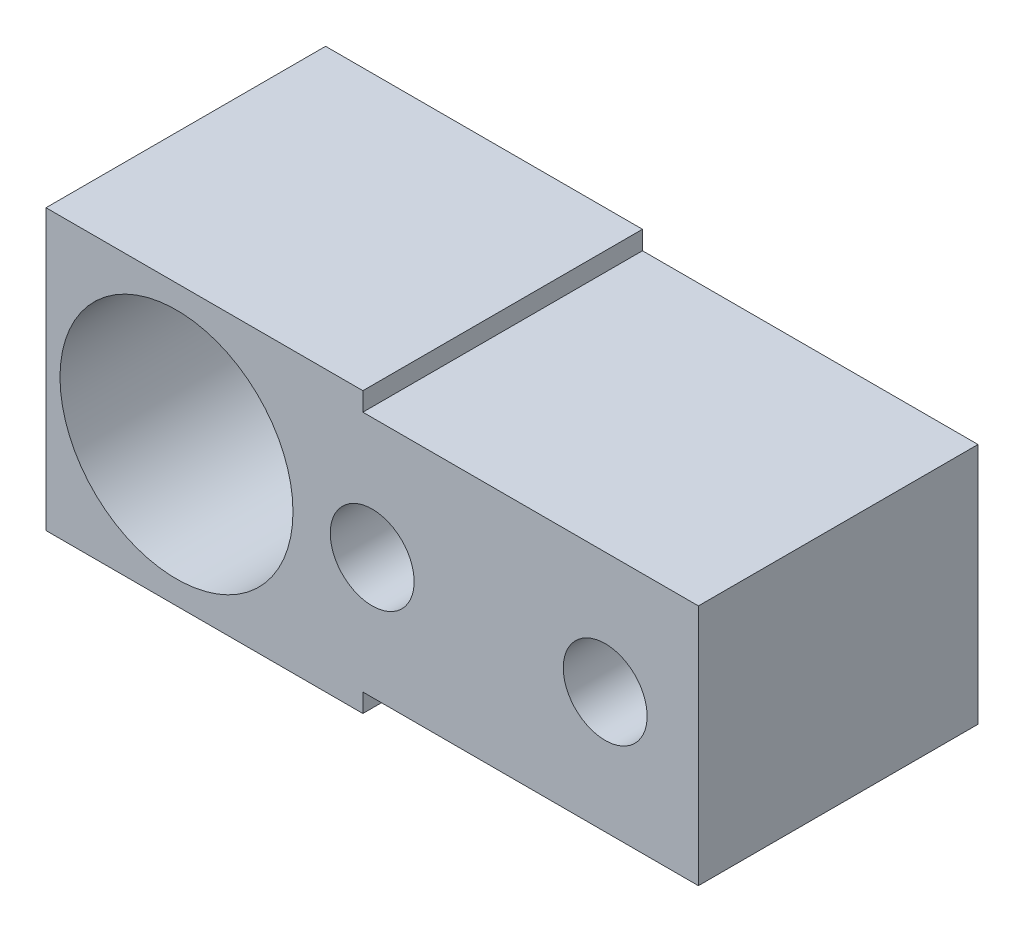
ISO-10303-21;
HEADER;
FILE_DESCRIPTION(('STEP AP214'),'2;1');
FILE_NAME('part.step','',(''),(''),'','','');
FILE_SCHEMA(('AUTOMOTIVE_DESIGN { 1 0 10303 214 1 1 1 1 }'));
ENDSEC;
DATA;
#1=APPLICATION_CONTEXT('core data for automotive mechanical design processes');
#2=APPLICATION_PROTOCOL_DEFINITION('international standard','automotive_design',2000,#1);
#3=PRODUCT_CONTEXT('',#1,'mechanical');
#4=PRODUCT('Part','Part','',(#3));
#5=PRODUCT_RELATED_PRODUCT_CATEGORY('part','',(#4));
#6=PRODUCT_DEFINITION_FORMATION('','',#4);
#7=PRODUCT_DEFINITION_CONTEXT('part definition',#1,'design');
#8=PRODUCT_DEFINITION('design','',#6,#7);
#9=PRODUCT_DEFINITION_SHAPE('','',#8);
#10=(LENGTH_UNIT() NAMED_UNIT(*) SI_UNIT(.MILLI.,.METRE.));
#11=(NAMED_UNIT(*) PLANE_ANGLE_UNIT() SI_UNIT($,.RADIAN.));
#12=(NAMED_UNIT(*) SI_UNIT($,.STERADIAN.) SOLID_ANGLE_UNIT());
#13=UNCERTAINTY_MEASURE_WITH_UNIT(LENGTH_MEASURE(1.E-05),#10,'distance_accuracy_value','');
#14=(GEOMETRIC_REPRESENTATION_CONTEXT(3) GLOBAL_UNCERTAINTY_ASSIGNED_CONTEXT((#13)) GLOBAL_UNIT_ASSIGNED_CONTEXT((#10,
#11,#12)) REPRESENTATION_CONTEXT('',''));
#15=CARTESIAN_POINT('',(0.,0.,0.));
#16=DIRECTION('',(0.,0.,1.));
#17=DIRECTION('',(1.,0.,0.));
#18=AXIS2_PLACEMENT_3D('',#15,#16,#17);
#19=CARTESIAN_POINT('',(0.,-15.,30.));
#20=DIRECTION('',(1.,0.,0.));
#21=DIRECTION('',(0.,1.,0.));
#22=AXIS2_PLACEMENT_3D('',#19,#20,#21);
#23=PLANE('',#22);
#24=DIRECTION('',(0.,-1.,0.));
#25=VECTOR('',#24,1.);
#26=CARTESIAN_POINT('',(0.,-15.,0.));
#27=LINE('',#26,#25);
#28=CARTESIAN_POINT('',(0.,15.,0.));
#29=VERTEX_POINT('',#28);
#30=CARTESIAN_POINT('',(0.,-15.,0.));
#31=VERTEX_POINT('',#30);
#32=EDGE_CURVE('E134',#29,#31,#27,.T.);
#33=ORIENTED_EDGE('',*,*,#32,.T.);
#34=DIRECTION('',(0.,0.,-1.));
#35=VECTOR('',#34,1.);
#36=CARTESIAN_POINT('',(0.,-15.,30.));
#37=LINE('',#36,#35);
#38=CARTESIAN_POINT('',(0.,-15.,30.));
#39=VERTEX_POINT('',#38);
#40=EDGE_CURVE('E162',#39,#31,#37,.T.);
#41=ORIENTED_EDGE('',*,*,#40,.F.);
#42=DIRECTION('',(0.,-1.,0.));
#43=VECTOR('',#42,1.);
#44=CARTESIAN_POINT('',(0.,-15.,30.));
#45=LINE('',#44,#43);
#46=CARTESIAN_POINT('',(0.,15.,30.));
#47=VERTEX_POINT('',#46);
#48=EDGE_CURVE('E149',#47,#39,#45,.T.);
#49=ORIENTED_EDGE('',*,*,#48,.F.);
#50=DIRECTION('',(0.,0.,-1.));
#51=VECTOR('',#50,1.);
#52=CARTESIAN_POINT('',(0.,15.,30.));
#53=LINE('',#52,#51);
#54=EDGE_CURVE('E130',#47,#29,#53,.T.);
#55=ORIENTED_EDGE('',*,*,#54,.T.);
#56=EDGE_LOOP('',(#33,#41,#49,#55));
#57=FACE_BOUND('',#56,.T.);
#58=ADVANCED_FACE('F36',(#57),#23,.F.);
#59=CARTESIAN_POINT('',(0.,-15.,30.));
#60=DIRECTION('',(0.,1.,0.));
#61=DIRECTION('',(0.,0.,1.));
#62=AXIS2_PLACEMENT_3D('',#59,#60,#61);
#63=PLANE('',#62);
#64=DIRECTION('',(1.,0.,0.));
#65=VECTOR('',#64,1.);
#66=CARTESIAN_POINT('',(0.,-15.,0.));
#67=LINE('',#66,#65);
#68=CARTESIAN_POINT('',(34.,-15.,0.));
#69=VERTEX_POINT('',#68);
#70=EDGE_CURVE('E137',#31,#69,#67,.T.);
#71=ORIENTED_EDGE('',*,*,#70,.T.);
#72=DIRECTION('',(0.,0.,-1.));
#73=VECTOR('',#72,1.);
#74=CARTESIAN_POINT('',(34.,-15.,30.));
#75=LINE('',#74,#73);
#76=CARTESIAN_POINT('',(34.,-15.,30.));
#77=VERTEX_POINT('',#76);
#78=EDGE_CURVE('E159',#77,#69,#75,.T.);
#79=ORIENTED_EDGE('',*,*,#78,.F.);
#80=DIRECTION('',(1.,0.,0.));
#81=VECTOR('',#80,1.);
#82=CARTESIAN_POINT('',(0.,-15.,30.));
#83=LINE('',#82,#81);
#84=EDGE_CURVE('E97',#39,#77,#83,.T.);
#85=ORIENTED_EDGE('',*,*,#84,.F.);
#86=ORIENTED_EDGE('',*,*,#40,.T.);
#87=EDGE_LOOP('',(#71,#79,#85,#86));
#88=FACE_BOUND('',#87,.T.);
#89=ADVANCED_FACE('F180',(#88),#63,.F.);
#90=CARTESIAN_POINT('',(34.,-13.,30.));
#91=DIRECTION('',(-1.,0.,0.));
#92=DIRECTION('',(0.,0.,1.));
#93=AXIS2_PLACEMENT_3D('',#90,#91,#92);
#94=PLANE('',#93);
#95=DIRECTION('',(0.,1.,0.));
#96=VECTOR('',#95,1.);
#97=CARTESIAN_POINT('',(34.,-13.,0.));
#98=LINE('',#97,#96);
#99=CARTESIAN_POINT('',(34.,-13.,0.));
#100=VERTEX_POINT('',#99);
#101=EDGE_CURVE('E140',#69,#100,#98,.T.);
#102=ORIENTED_EDGE('',*,*,#101,.T.);
#103=DIRECTION('',(0.,0.,-1.));
#104=VECTOR('',#103,1.);
#105=CARTESIAN_POINT('',(34.,-13.,30.));
#106=LINE('',#105,#104);
#107=CARTESIAN_POINT('',(34.,-13.,30.));
#108=VERTEX_POINT('',#107);
#109=EDGE_CURVE('E156',#108,#100,#106,.T.);
#110=ORIENTED_EDGE('',*,*,#109,.F.);
#111=DIRECTION('',(0.,1.,0.));
#112=VECTOR('',#111,1.);
#113=CARTESIAN_POINT('',(34.,-13.,30.));
#114=LINE('',#113,#112);
#115=EDGE_CURVE('E281',#77,#108,#114,.T.);
#116=ORIENTED_EDGE('',*,*,#115,.F.);
#117=ORIENTED_EDGE('',*,*,#78,.T.);
#118=EDGE_LOOP('',(#102,#110,#116,#117));
#119=FACE_BOUND('',#118,.T.);
#120=ADVANCED_FACE('F185',(#119),#94,.F.);
#121=CARTESIAN_POINT('',(70.,-13.,30.));
#122=DIRECTION('',(0.,1.,0.));
#123=DIRECTION('',(-1.,0.,0.));
#124=AXIS2_PLACEMENT_3D('',#121,#122,#123);
#125=PLANE('',#124);
#126=DIRECTION('',(1.,0.,0.));
#127=VECTOR('',#126,1.);
#128=CARTESIAN_POINT('',(70.,-13.,0.));
#129=LINE('',#128,#127);
#130=CARTESIAN_POINT('',(70.,-13.,0.));
#131=VERTEX_POINT('',#130);
#132=EDGE_CURVE('E142',#100,#131,#129,.T.);
#133=ORIENTED_EDGE('',*,*,#132,.T.);
#134=DIRECTION('',(0.,0.,-1.));
#135=VECTOR('',#134,1.);
#136=CARTESIAN_POINT('',(70.,-13.,30.));
#137=LINE('',#136,#135);
#138=CARTESIAN_POINT('',(70.,-13.,30.));
#139=VERTEX_POINT('',#138);
#140=EDGE_CURVE('E153',#139,#131,#137,.T.);
#141=ORIENTED_EDGE('',*,*,#140,.F.);
#142=DIRECTION('',(1.,0.,0.));
#143=VECTOR('',#142,1.);
#144=CARTESIAN_POINT('',(70.,-13.,30.));
#145=LINE('',#144,#143);
#146=EDGE_CURVE('E283',#108,#139,#145,.T.);
#147=ORIENTED_EDGE('',*,*,#146,.F.);
#148=ORIENTED_EDGE('',*,*,#109,.T.);
#149=EDGE_LOOP('',(#133,#141,#147,#148));
#150=FACE_BOUND('',#149,.T.);
#151=ADVANCED_FACE('F190',(#150),#125,.F.);
#152=CARTESIAN_POINT('',(70.,-13.,30.));
#153=DIRECTION('',(-1.,0.,0.));
#154=DIRECTION('',(0.,0.,1.));
#155=AXIS2_PLACEMENT_3D('',#152,#153,#154);
#156=PLANE('',#155);
#157=DIRECTION('',(0.,1.,0.));
#158=VECTOR('',#157,1.);
#159=CARTESIAN_POINT('',(70.,-13.,0.));
#160=LINE('',#159,#158);
#161=CARTESIAN_POINT('',(70.,13.,0.));
#162=VERTEX_POINT('',#161);
#163=EDGE_CURVE('E144',#131,#162,#160,.T.);
#164=ORIENTED_EDGE('',*,*,#163,.T.);
#165=DIRECTION('',(0.,0.,-1.));
#166=VECTOR('',#165,1.);
#167=CARTESIAN_POINT('',(70.,13.,30.));
#168=LINE('',#167,#166);
#169=CARTESIAN_POINT('',(70.,13.,30.));
#170=VERTEX_POINT('',#169);
#171=EDGE_CURVE('E125',#170,#162,#168,.T.);
#172=ORIENTED_EDGE('',*,*,#171,.F.);
#173=DIRECTION('',(0.,1.,0.));
#174=VECTOR('',#173,1.);
#175=CARTESIAN_POINT('',(70.,-13.,30.));
#176=LINE('',#175,#174);
#177=EDGE_CURVE('E116',#139,#170,#176,.T.);
#178=ORIENTED_EDGE('',*,*,#177,.F.);
#179=ORIENTED_EDGE('',*,*,#140,.T.);
#180=EDGE_LOOP('',(#164,#172,#178,#179));
#181=FACE_BOUND('',#180,.T.);
#182=ADVANCED_FACE('F194',(#181),#156,.F.);
#183=CARTESIAN_POINT('',(34.,13.,30.));
#184=DIRECTION('',(0.,-1.,0.));
#185=DIRECTION('',(0.,0.,-1.));
#186=AXIS2_PLACEMENT_3D('',#183,#184,#185);
#187=PLANE('',#186);
#188=DIRECTION('',(-1.,0.,0.));
#189=VECTOR('',#188,1.);
#190=CARTESIAN_POINT('',(34.,13.,0.));
#191=LINE('',#190,#189);
#192=CARTESIAN_POINT('',(34.,13.,0.));
#193=VERTEX_POINT('',#192);
#194=EDGE_CURVE('E124',#162,#193,#191,.T.);
#195=ORIENTED_EDGE('',*,*,#194,.T.);
#196=DIRECTION('',(0.,0.,-1.));
#197=VECTOR('',#196,1.);
#198=CARTESIAN_POINT('',(34.,13.,30.));
#199=LINE('',#198,#197);
#200=CARTESIAN_POINT('',(34.,13.,30.));
#201=VERTEX_POINT('',#200);
#202=EDGE_CURVE('E121',#201,#193,#199,.T.);
#203=ORIENTED_EDGE('',*,*,#202,.F.);
#204=DIRECTION('',(-1.,0.,0.));
#205=VECTOR('',#204,1.);
#206=CARTESIAN_POINT('',(34.,13.,30.));
#207=LINE('',#206,#205);
#208=EDGE_CURVE('E110',#170,#201,#207,.T.);
#209=ORIENTED_EDGE('',*,*,#208,.F.);
#210=ORIENTED_EDGE('',*,*,#171,.T.);
#211=EDGE_LOOP('',(#195,#203,#209,#210));
#212=FACE_BOUND('',#211,.T.);
#213=ADVANCED_FACE('F122',(#212),#187,.F.);
#214=CARTESIAN_POINT('',(34.,15.,30.));
#215=DIRECTION('',(-1.,0.,0.));
#216=DIRECTION('',(0.,0.,1.));
#217=AXIS2_PLACEMENT_3D('',#214,#215,#216);
#218=PLANE('',#217);
#219=DIRECTION('',(0.,1.,0.));
#220=VECTOR('',#219,1.);
#221=CARTESIAN_POINT('',(34.,15.,0.));
#222=LINE('',#221,#220);
#223=CARTESIAN_POINT('',(34.,15.,0.));
#224=VERTEX_POINT('',#223);
#225=EDGE_CURVE('E82',#193,#224,#222,.T.);
#226=ORIENTED_EDGE('',*,*,#225,.T.);
#227=DIRECTION('',(0.,0.,-1.));
#228=VECTOR('',#227,1.);
#229=CARTESIAN_POINT('',(34.,15.,30.));
#230=LINE('',#229,#228);
#231=CARTESIAN_POINT('',(34.,15.,30.));
#232=VERTEX_POINT('',#231);
#233=EDGE_CURVE('E126',#232,#224,#230,.T.);
#234=ORIENTED_EDGE('',*,*,#233,.F.);
#235=DIRECTION('',(0.,1.,0.));
#236=VECTOR('',#235,1.);
#237=CARTESIAN_POINT('',(34.,15.,30.));
#238=LINE('',#237,#236);
#239=EDGE_CURVE('E114',#201,#232,#238,.T.);
#240=ORIENTED_EDGE('',*,*,#239,.F.);
#241=ORIENTED_EDGE('',*,*,#202,.T.);
#242=EDGE_LOOP('',(#226,#234,#240,#241));
#243=FACE_BOUND('',#242,.T.);
#244=ADVANCED_FACE('F128',(#243),#218,.F.);
#245=CARTESIAN_POINT('',(0.,15.,30.));
#246=DIRECTION('',(0.,-1.,0.));
#247=DIRECTION('',(1.,0.,0.));
#248=AXIS2_PLACEMENT_3D('',#245,#246,#247);
#249=PLANE('',#248);
#250=DIRECTION('',(-1.,0.,0.));
#251=VECTOR('',#250,1.);
#252=CARTESIAN_POINT('',(0.,15.,0.));
#253=LINE('',#252,#251);
#254=EDGE_CURVE('E88',#224,#29,#253,.T.);
#255=ORIENTED_EDGE('',*,*,#254,.T.);
#256=ORIENTED_EDGE('',*,*,#54,.F.);
#257=DIRECTION('',(-1.,0.,0.));
#258=VECTOR('',#257,1.);
#259=CARTESIAN_POINT('',(0.,15.,30.));
#260=LINE('',#259,#258);
#261=EDGE_CURVE('E53',#232,#47,#260,.T.);
#262=ORIENTED_EDGE('',*,*,#261,.F.);
#263=ORIENTED_EDGE('',*,*,#233,.T.);
#264=EDGE_LOOP('',(#255,#256,#262,#263));
#265=FACE_BOUND('',#264,.T.);
#266=ADVANCED_FACE('F203',(#265),#249,.F.);
#267=CARTESIAN_POINT('',(0.,0.,30.));
#268=DIRECTION('',(0.,0.,-1.));
#269=DIRECTION('',(-1.,0.,0.));
#270=AXIS2_PLACEMENT_3D('',#267,#268,#269);
#271=PLANE('',#270);
#272=CARTESIAN_POINT('',(60.,0.,30.));
#273=DIRECTION('',(0.,0.,-1.));
#274=DIRECTION('',(-1.,0.,0.));
#275=AXIS2_PLACEMENT_3D('',#272,#273,#274);
#276=CIRCLE('',#275,4.49999999999999);
#277=CARTESIAN_POINT('',(55.5,0.,30.));
#278=VERTEX_POINT('',#277);
#279=EDGE_CURVE('E252',#278,#278,#276,.T.);
#280=ORIENTED_EDGE('',*,*,#279,.T.);
#281=EDGE_LOOP('',(#280));
#282=FACE_BOUND('',#281,.T.);
#283=CARTESIAN_POINT('',(35.,0.,30.));
#284=DIRECTION('',(0.,0.,-1.));
#285=DIRECTION('',(-1.,0.,0.));
#286=AXIS2_PLACEMENT_3D('',#283,#284,#285);
#287=CIRCLE('',#286,4.49999999999999);
#288=CARTESIAN_POINT('',(30.5,0.,30.));
#289=VERTEX_POINT('',#288);
#290=EDGE_CURVE('E268',#289,#289,#287,.T.);
#291=ORIENTED_EDGE('',*,*,#290,.T.);
#292=EDGE_LOOP('',(#291));
#293=FACE_BOUND('',#292,.T.);
#294=CARTESIAN_POINT('',(14.,0.,30.));
#295=DIRECTION('',(0.,0.,1.));
#296=DIRECTION('',(1.,0.,0.));
#297=AXIS2_PLACEMENT_3D('',#294,#295,#296);
#298=CIRCLE('',#297,12.5);
#299=CARTESIAN_POINT('',(26.5,0.,30.));
#300=VERTEX_POINT('',#299);
#301=EDGE_CURVE('E274',#300,#300,#298,.T.);
#302=ORIENTED_EDGE('',*,*,#301,.F.);
#303=EDGE_LOOP('',(#302));
#304=FACE_BOUND('',#303,.T.);
#305=ORIENTED_EDGE('',*,*,#48,.T.);
#306=ORIENTED_EDGE('',*,*,#84,.T.);
#307=ORIENTED_EDGE('',*,*,#115,.T.);
#308=ORIENTED_EDGE('',*,*,#146,.T.);
#309=ORIENTED_EDGE('',*,*,#177,.T.);
#310=ORIENTED_EDGE('',*,*,#208,.T.);
#311=ORIENTED_EDGE('',*,*,#239,.T.);
#312=ORIENTED_EDGE('',*,*,#261,.T.);
#313=EDGE_LOOP('',(#305,#306,#307,#308,#309,#310,#311,#312));
#314=FACE_BOUND('',#313,.T.);
#315=ADVANCED_FACE('F112',(#282,#293,#304,#314),#271,.F.);
#316=CARTESIAN_POINT('',(0.,0.,0.));
#317=DIRECTION('',(0.,0.,-1.));
#318=DIRECTION('',(-1.,0.,0.));
#319=AXIS2_PLACEMENT_3D('',#316,#317,#318);
#320=PLANE('',#319);
#321=CARTESIAN_POINT('',(60.,0.,0.));
#322=DIRECTION('',(0.,0.,-1.));
#323=DIRECTION('',(-1.,0.,0.));
#324=AXIS2_PLACEMENT_3D('',#321,#322,#323);
#325=CIRCLE('',#324,7.49999999999999);
#326=CARTESIAN_POINT('',(52.5,0.,0.));
#327=VERTEX_POINT('',#326);
#328=EDGE_CURVE('E250',#327,#327,#325,.T.);
#329=ORIENTED_EDGE('',*,*,#328,.F.);
#330=EDGE_LOOP('',(#329));
#331=FACE_BOUND('',#330,.T.);
#332=CARTESIAN_POINT('',(35.,0.,0.));
#333=DIRECTION('',(0.,0.,-1.));
#334=DIRECTION('',(-1.,0.,0.));
#335=AXIS2_PLACEMENT_3D('',#332,#333,#334);
#336=CIRCLE('',#335,7.5);
#337=CARTESIAN_POINT('',(27.5,0.,0.));
#338=VERTEX_POINT('',#337);
#339=EDGE_CURVE('E259',#338,#338,#336,.T.);
#340=ORIENTED_EDGE('',*,*,#339,.F.);
#341=EDGE_LOOP('',(#340));
#342=FACE_BOUND('',#341,.T.);
#343=CARTESIAN_POINT('',(14.,0.,0.));
#344=DIRECTION('',(0.,0.,-1.));
#345=DIRECTION('',(-1.,0.,0.));
#346=AXIS2_PLACEMENT_3D('',#343,#344,#345);
#347=CIRCLE('',#346,7.);
#348=CARTESIAN_POINT('',(7.,0.,0.));
#349=VERTEX_POINT('',#348);
#350=EDGE_CURVE('E271',#349,#349,#347,.T.);
#351=ORIENTED_EDGE('',*,*,#350,.F.);
#352=EDGE_LOOP('',(#351));
#353=FACE_BOUND('',#352,.T.);
#354=ORIENTED_EDGE('',*,*,#32,.F.);
#355=ORIENTED_EDGE('',*,*,#254,.F.);
#356=ORIENTED_EDGE('',*,*,#225,.F.);
#357=ORIENTED_EDGE('',*,*,#194,.F.);
#358=ORIENTED_EDGE('',*,*,#163,.F.);
#359=ORIENTED_EDGE('',*,*,#132,.F.);
#360=ORIENTED_EDGE('',*,*,#101,.F.);
#361=ORIENTED_EDGE('',*,*,#70,.F.);
#362=EDGE_LOOP('',(#354,#355,#356,#357,#358,#359,#360,#361));
#363=FACE_BOUND('',#362,.T.);
#364=ADVANCED_FACE('F206',(#331,#342,#353,#363),#320,.T.);
#365=CARTESIAN_POINT('',(14.,0.,10.));
#366=DIRECTION('',(0.,0.,1.));
#367=DIRECTION('',(1.,0.,0.));
#368=AXIS2_PLACEMENT_3D('',#365,#366,#367);
#369=CYLINDRICAL_SURFACE('',#368,12.5);
#370=CARTESIAN_POINT('',(14.,0.,10.));
#371=DIRECTION('',(0.,0.,1.));
#372=DIRECTION('',(1.,0.,0.));
#373=AXIS2_PLACEMENT_3D('',#370,#371,#372);
#374=CIRCLE('',#373,12.5);
#375=CARTESIAN_POINT('',(26.5,0.,10.));
#376=VERTEX_POINT('',#375);
#377=EDGE_CURVE('E138',#376,#376,#374,.T.);
#378=ORIENTED_EDGE('',*,*,#377,.F.);
#379=EDGE_LOOP('',(#378));
#380=FACE_BOUND('',#379,.T.);
#381=ORIENTED_EDGE('',*,*,#301,.T.);
#382=EDGE_LOOP('',(#381));
#383=FACE_BOUND('',#382,.T.);
#384=ADVANCED_FACE('F209',(#380,#383),#369,.F.);
#385=CARTESIAN_POINT('',(14.,0.,10.));
#386=DIRECTION('',(0.,0.,1.));
#387=DIRECTION('',(1.,0.,0.));
#388=AXIS2_PLACEMENT_3D('',#385,#386,#387);
#389=PLANE('',#388);
#390=CARTESIAN_POINT('',(14.,0.,10.));
#391=DIRECTION('',(0.,0.,1.));
#392=DIRECTION('',(1.,0.,0.));
#393=AXIS2_PLACEMENT_3D('',#390,#391,#392);
#394=CIRCLE('',#393,7.49999999999999);
#395=CARTESIAN_POINT('',(21.5,0.,10.));
#396=VERTEX_POINT('',#395);
#397=EDGE_CURVE('E11',#396,#396,#394,.F.);
#398=ORIENTED_EDGE('',*,*,#397,.T.);
#399=EDGE_LOOP('',(#398));
#400=FACE_BOUND('',#399,.T.);
#401=ORIENTED_EDGE('',*,*,#377,.T.);
#402=EDGE_LOOP('',(#401));
#403=FACE_BOUND('',#402,.T.);
#404=ADVANCED_FACE('F216',(#400,#403),#389,.T.);
#405=CARTESIAN_POINT('',(14.,0.,0.));
#406=DIRECTION('',(0.,0.,-1.));
#407=DIRECTION('',(-1.,0.,0.));
#408=AXIS2_PLACEMENT_3D('',#405,#406,#407);
#409=CYLINDRICAL_SURFACE('',#408,6.99999999999999);
#410=CARTESIAN_POINT('',(14.,0.,9.5));
#411=DIRECTION('',(0.,0.,1.));
#412=DIRECTION('',(1.,0.,0.));
#413=AXIS2_PLACEMENT_3D('',#410,#411,#412);
#414=CIRCLE('',#413,6.99999999999999);
#415=CARTESIAN_POINT('',(21.,0.,9.5));
#416=VERTEX_POINT('',#415);
#417=EDGE_CURVE('E45',#416,#416,#414,.T.);
#418=ORIENTED_EDGE('',*,*,#417,.T.);
#419=EDGE_LOOP('',(#418));
#420=FACE_BOUND('',#419,.T.);
#421=ORIENTED_EDGE('',*,*,#350,.T.);
#422=EDGE_LOOP('',(#421));
#423=FACE_BOUND('',#422,.T.);
#424=ADVANCED_FACE('F166',(#420,#423),#409,.F.);
#425=CARTESIAN_POINT('',(35.,0.,0.));
#426=DIRECTION('',(0.,0.,-1.));
#427=DIRECTION('',(-1.,0.,0.));
#428=AXIS2_PLACEMENT_3D('',#425,#426,#427);
#429=CYLINDRICAL_SURFACE('',#428,4.49999999999999);
#430=ORIENTED_EDGE('',*,*,#290,.F.);
#431=EDGE_LOOP('',(#430));
#432=FACE_BOUND('',#431,.T.);
#433=CARTESIAN_POINT('',(35.,0.,8.6));
#434=DIRECTION('',(0.,0.,-1.));
#435=DIRECTION('',(-1.,0.,0.));
#436=AXIS2_PLACEMENT_3D('',#433,#434,#435);
#437=CIRCLE('',#436,4.5);
#438=CARTESIAN_POINT('',(30.5,0.,8.6));
#439=VERTEX_POINT('',#438);
#440=EDGE_CURVE('E265',#439,#439,#437,.T.);
#441=ORIENTED_EDGE('',*,*,#440,.T.);
#442=EDGE_LOOP('',(#441));
#443=FACE_BOUND('',#442,.T.);
#444=ADVANCED_FACE('F223',(#432,#443),#429,.F.);
#445=CARTESIAN_POINT('',(39.5,0.,8.6));
#446=DIRECTION('',(0.,0.,1.));
#447=DIRECTION('',(1.,0.,0.));
#448=AXIS2_PLACEMENT_3D('',#445,#446,#447);
#449=PLANE('',#448);
#450=ORIENTED_EDGE('',*,*,#440,.F.);
#451=EDGE_LOOP('',(#450));
#452=FACE_BOUND('',#451,.T.);
#453=CARTESIAN_POINT('',(35.,0.,8.6));
#454=DIRECTION('',(0.,0.,-1.));
#455=DIRECTION('',(-1.,0.,0.));
#456=AXIS2_PLACEMENT_3D('',#453,#454,#455);
#457=CIRCLE('',#456,7.5);
#458=CARTESIAN_POINT('',(27.5,0.,8.6));
#459=VERTEX_POINT('',#458);
#460=EDGE_CURVE('E262',#459,#459,#457,.T.);
#461=ORIENTED_EDGE('',*,*,#460,.T.);
#462=EDGE_LOOP('',(#461));
#463=FACE_BOUND('',#462,.T.);
#464=ADVANCED_FACE('F226',(#452,#463),#449,.F.);
#465=CARTESIAN_POINT('',(35.,0.,0.));
#466=DIRECTION('',(0.,0.,-1.));
#467=DIRECTION('',(-1.,0.,0.));
#468=AXIS2_PLACEMENT_3D('',#465,#466,#467);
#469=CYLINDRICAL_SURFACE('',#468,7.5);
#470=ORIENTED_EDGE('',*,*,#460,.F.);
#471=EDGE_LOOP('',(#470));
#472=FACE_BOUND('',#471,.T.);
#473=ORIENTED_EDGE('',*,*,#339,.T.);
#474=EDGE_LOOP('',(#473));
#475=FACE_BOUND('',#474,.T.);
#476=ADVANCED_FACE('F230',(#472,#475),#469,.F.);
#477=CARTESIAN_POINT('',(60.,0.,0.));
#478=DIRECTION('',(0.,0.,-1.));
#479=DIRECTION('',(-1.,0.,0.));
#480=AXIS2_PLACEMENT_3D('',#477,#478,#479);
#481=CYLINDRICAL_SURFACE('',#480,4.5);
#482=ORIENTED_EDGE('',*,*,#279,.F.);
#483=EDGE_LOOP('',(#482));
#484=FACE_BOUND('',#483,.T.);
#485=CARTESIAN_POINT('',(60.,0.,8.6));
#486=DIRECTION('',(0.,0.,-1.));
#487=DIRECTION('',(-1.,0.,0.));
#488=AXIS2_PLACEMENT_3D('',#485,#486,#487);
#489=CIRCLE('',#488,4.5);
#490=CARTESIAN_POINT('',(55.5,0.,8.6));
#491=VERTEX_POINT('',#490);
#492=EDGE_CURVE('E246',#491,#491,#489,.T.);
#493=ORIENTED_EDGE('',*,*,#492,.T.);
#494=EDGE_LOOP('',(#493));
#495=FACE_BOUND('',#494,.T.);
#496=ADVANCED_FACE('F234',(#484,#495),#481,.F.);
#497=CARTESIAN_POINT('',(64.5,0.,8.6));
#498=DIRECTION('',(0.,0.,1.));
#499=DIRECTION('',(1.,0.,0.));
#500=AXIS2_PLACEMENT_3D('',#497,#498,#499);
#501=PLANE('',#500);
#502=ORIENTED_EDGE('',*,*,#492,.F.);
#503=EDGE_LOOP('',(#502));
#504=FACE_BOUND('',#503,.T.);
#505=CARTESIAN_POINT('',(60.,0.,8.6));
#506=DIRECTION('',(0.,0.,-1.));
#507=DIRECTION('',(-1.,0.,0.));
#508=AXIS2_PLACEMENT_3D('',#505,#506,#507);
#509=CIRCLE('',#508,7.49999999999999);
#510=CARTESIAN_POINT('',(52.5,0.,8.6));
#511=VERTEX_POINT('',#510);
#512=EDGE_CURVE('E249',#511,#511,#509,.T.);
#513=ORIENTED_EDGE('',*,*,#512,.T.);
#514=EDGE_LOOP('',(#513));
#515=FACE_BOUND('',#514,.T.);
#516=ADVANCED_FACE('F175',(#504,#515),#501,.F.);
#517=CARTESIAN_POINT('',(60.,0.,0.));
#518=DIRECTION('',(0.,0.,-1.));
#519=DIRECTION('',(-1.,0.,0.));
#520=AXIS2_PLACEMENT_3D('',#517,#518,#519);
#521=CYLINDRICAL_SURFACE('',#520,7.49999999999999);
#522=ORIENTED_EDGE('',*,*,#512,.F.);
#523=EDGE_LOOP('',(#522));
#524=FACE_BOUND('',#523,.T.);
#525=ORIENTED_EDGE('',*,*,#328,.T.);
#526=EDGE_LOOP('',(#525));
#527=FACE_BOUND('',#526,.T.);
#528=ADVANCED_FACE('F170',(#524,#527),#521,.F.);
#529=CARTESIAN_POINT('',(14.,0.,9.5));
#530=DIRECTION('',(0.,0.,1.));
#531=DIRECTION('',(1.,0.,0.));
#532=AXIS2_PLACEMENT_3D('',#529,#530,#531);
#533=CONICAL_SURFACE('',#532,6.99999999999999,0.785398163397445);
#534=ORIENTED_EDGE('',*,*,#397,.F.);
#535=EDGE_LOOP('',(#534));
#536=FACE_BOUND('',#535,.T.);
#537=ORIENTED_EDGE('',*,*,#417,.F.);
#538=EDGE_LOOP('',(#537));
#539=FACE_BOUND('',#538,.T.);
#540=ADVANCED_FACE('F38',(#536,#539),#533,.F.);
#541=CLOSED_SHELL('',(#58,#89,#120,#151,#182,#213,#244,#266,#315,#364,#384,#404,#424,#444,#464,
#476,#496,#516,#528,#540));
#542=MANIFOLD_SOLID_BREP('B2',#541);
#543=ADVANCED_BREP_SHAPE_REPRESENTATION('',(#18,#542),#14);
#544=SHAPE_DEFINITION_REPRESENTATION(#9,#543);
ENDSEC;
END-ISO-10303-21;
